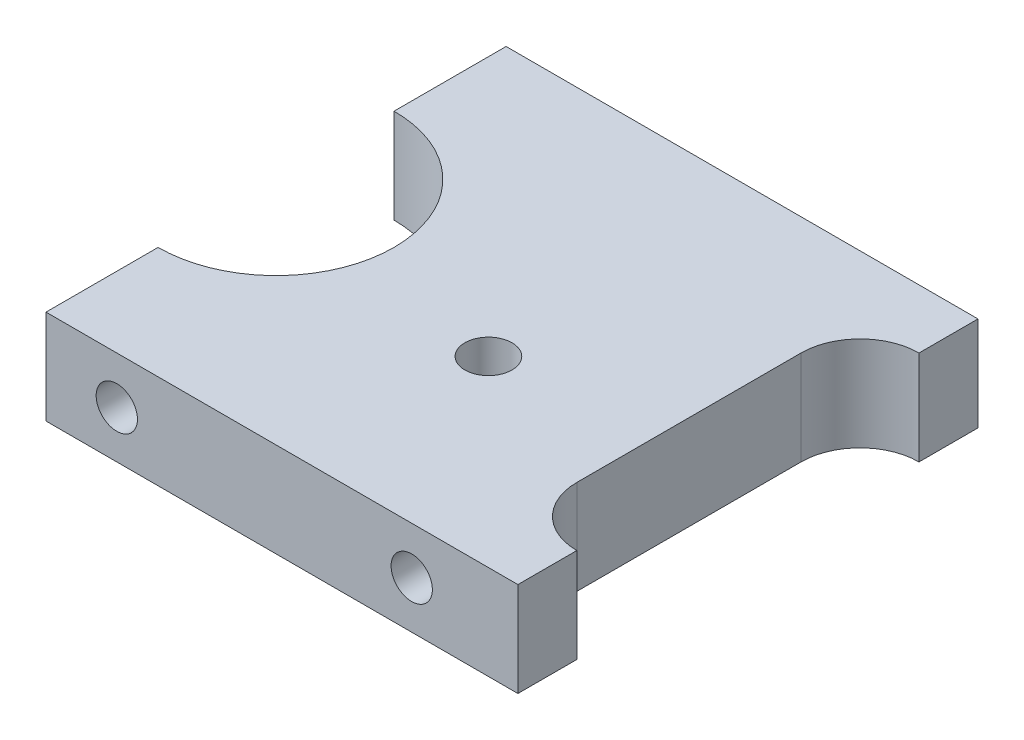
ISO-10303-21;
HEADER;
FILE_DESCRIPTION(('STEP AP214'),'2;1');
FILE_NAME('part.step','',(''),(''),'','','');
FILE_SCHEMA(('AUTOMOTIVE_DESIGN { 1 0 10303 214 1 1 1 1 }'));
ENDSEC;
DATA;
#1=APPLICATION_CONTEXT('core data for automotive mechanical design processes');
#2=APPLICATION_PROTOCOL_DEFINITION('international standard','automotive_design',2000,#1);
#3=PRODUCT_CONTEXT('',#1,'mechanical');
#4=PRODUCT('Part','Part','',(#3));
#5=PRODUCT_RELATED_PRODUCT_CATEGORY('part','',(#4));
#6=PRODUCT_DEFINITION_FORMATION('','',#4);
#7=PRODUCT_DEFINITION_CONTEXT('part definition',#1,'design');
#8=PRODUCT_DEFINITION('design','',#6,#7);
#9=PRODUCT_DEFINITION_SHAPE('','',#8);
#10=(LENGTH_UNIT() NAMED_UNIT(*) SI_UNIT(.MILLI.,.METRE.));
#11=(NAMED_UNIT(*) PLANE_ANGLE_UNIT() SI_UNIT($,.RADIAN.));
#12=(NAMED_UNIT(*) SI_UNIT($,.STERADIAN.) SOLID_ANGLE_UNIT());
#13=UNCERTAINTY_MEASURE_WITH_UNIT(LENGTH_MEASURE(1.E-05),#10,'distance_accuracy_value','');
#14=(GEOMETRIC_REPRESENTATION_CONTEXT(3) GLOBAL_UNCERTAINTY_ASSIGNED_CONTEXT((#13)) GLOBAL_UNIT_ASSIGNED_CONTEXT((#10,
#11,#12)) REPRESENTATION_CONTEXT('',''));
#15=CARTESIAN_POINT('',(0.,0.,0.));
#16=DIRECTION('',(0.,0.,1.));
#17=DIRECTION('',(1.,0.,0.));
#18=AXIS2_PLACEMENT_3D('',#15,#16,#17);
#19=CARTESIAN_POINT('',(18.,8.,-23.5));
#20=DIRECTION('',(-1.,0.,0.));
#21=DIRECTION('',(0.,0.,1.));
#22=AXIS2_PLACEMENT_3D('',#19,#20,#21);
#23=PLANE('',#22);
#24=DIRECTION('',(0.,0.,-1.));
#25=VECTOR('',#24,1.);
#26=CARTESIAN_POINT('',(18.,0.,-23.5));
#27=LINE('',#26,#25);
#28=CARTESIAN_POINT('',(18.,0.,15.5));
#29=VERTEX_POINT('',#28);
#30=CARTESIAN_POINT('',(18.,0.,10.5));
#31=VERTEX_POINT('',#30);
#32=EDGE_CURVE('E197',#29,#31,#27,.T.);
#33=ORIENTED_EDGE('',*,*,#32,.T.);
#34=DIRECTION('',(0.,1.,0.));
#35=VECTOR('',#34,1.);
#36=CARTESIAN_POINT('',(18.,-2.,10.5));
#37=LINE('',#36,#35);
#38=CARTESIAN_POINT('',(18.,8.,10.5));
#39=VERTEX_POINT('',#38);
#40=EDGE_CURVE('E48',#31,#39,#37,.T.);
#41=ORIENTED_EDGE('',*,*,#40,.T.);
#42=DIRECTION('',(0.,0.,-1.));
#43=VECTOR('',#42,1.);
#44=CARTESIAN_POINT('',(18.,8.,-23.5));
#45=LINE('',#44,#43);
#46=CARTESIAN_POINT('',(18.,8.,15.5));
#47=VERTEX_POINT('',#46);
#48=EDGE_CURVE('E186',#47,#39,#45,.T.);
#49=ORIENTED_EDGE('',*,*,#48,.F.);
#50=DIRECTION('',(0.,-1.,0.));
#51=VECTOR('',#50,1.);
#52=CARTESIAN_POINT('',(18.,8.,15.5));
#53=LINE('',#52,#51);
#54=EDGE_CURVE('E207',#47,#29,#53,.T.);
#55=ORIENTED_EDGE('',*,*,#54,.T.);
#56=EDGE_LOOP('',(#33,#41,#49,#55));
#57=FACE_BOUND('',#56,.T.);
#58=ADVANCED_FACE('F40',(#57),#23,.F.);
#59=CARTESIAN_POINT('',(-22.,8.,-23.5));
#60=DIRECTION('',(1.,0.,0.));
#61=DIRECTION('',(0.,0.,-1.));
#62=AXIS2_PLACEMENT_3D('',#59,#60,#61);
#63=PLANE('',#62);
#64=DIRECTION('',(0.,0.,1.));
#65=VECTOR('',#64,1.);
#66=CARTESIAN_POINT('',(-22.,8.,-23.5));
#67=LINE('',#66,#65);
#68=CARTESIAN_POINT('',(-22.,8.,6.));
#69=VERTEX_POINT('',#68);
#70=CARTESIAN_POINT('',(-22.,8.,15.5));
#71=VERTEX_POINT('',#70);
#72=EDGE_CURVE('E183',#69,#71,#67,.T.);
#73=ORIENTED_EDGE('',*,*,#72,.F.);
#74=DIRECTION('',(0.,-1.,0.));
#75=VECTOR('',#74,1.);
#76=CARTESIAN_POINT('',(-22.,10.,6.));
#77=LINE('',#76,#75);
#78=CARTESIAN_POINT('',(-22.,0.,6.));
#79=VERTEX_POINT('',#78);
#80=EDGE_CURVE('E215',#69,#79,#77,.T.);
#81=ORIENTED_EDGE('',*,*,#80,.T.);
#82=DIRECTION('',(0.,0.,1.));
#83=VECTOR('',#82,1.);
#84=CARTESIAN_POINT('',(-22.,0.,-23.5));
#85=LINE('',#84,#83);
#86=CARTESIAN_POINT('',(-22.,0.,15.5));
#87=VERTEX_POINT('',#86);
#88=EDGE_CURVE('E176',#79,#87,#85,.T.);
#89=ORIENTED_EDGE('',*,*,#88,.T.);
#90=DIRECTION('',(0.,-1.,0.));
#91=VECTOR('',#90,1.);
#92=CARTESIAN_POINT('',(-22.,8.,15.5));
#93=LINE('',#92,#91);
#94=EDGE_CURVE('E210',#71,#87,#93,.T.);
#95=ORIENTED_EDGE('',*,*,#94,.F.);
#96=EDGE_LOOP('',(#73,#81,#89,#95));
#97=FACE_BOUND('',#96,.T.);
#98=ADVANCED_FACE('F246',(#97),#63,.F.);
#99=CARTESIAN_POINT('',(0.,8.,0.));
#100=DIRECTION('',(0.,1.,0.));
#101=DIRECTION('',(0.,0.,1.));
#102=AXIS2_PLACEMENT_3D('',#99,#100,#101);
#103=PLANE('',#102);
#104=CARTESIAN_POINT('',(18.,8.,5.5));
#105=DIRECTION('',(0.,1.,0.));
#106=DIRECTION('',(0.,0.,1.));
#107=AXIS2_PLACEMENT_3D('',#104,#105,#106);
#108=CIRCLE('',#107,5.);
#109=CARTESIAN_POINT('',(13.,8.,5.5));
#110=VERTEX_POINT('',#109);
#111=EDGE_CURVE('E132',#110,#39,#108,.T.);
#112=ORIENTED_EDGE('',*,*,#111,.F.);
#113=DIRECTION('',(0.,0.,1.));
#114=VECTOR('',#113,1.);
#115=CARTESIAN_POINT('',(13.,8.,5.5));
#116=LINE('',#115,#114);
#117=CARTESIAN_POINT('',(13.,8.,-13.5));
#118=VERTEX_POINT('',#117);
#119=EDGE_CURVE('E122',#118,#110,#116,.T.);
#120=ORIENTED_EDGE('',*,*,#119,.F.);
#121=CARTESIAN_POINT('',(18.,8.,-13.5));
#122=DIRECTION('',(0.,1.,0.));
#123=DIRECTION('',(0.,0.,1.));
#124=AXIS2_PLACEMENT_3D('',#121,#122,#123);
#125=CIRCLE('',#124,5.);
#126=CARTESIAN_POINT('',(18.,8.,-18.5));
#127=VERTEX_POINT('',#126);
#128=EDGE_CURVE('E127',#127,#118,#125,.T.);
#129=ORIENTED_EDGE('',*,*,#128,.F.);
#130=CARTESIAN_POINT('',(18.,8.,-23.5));
#131=VERTEX_POINT('',#130);
#132=EDGE_CURVE('E185',#127,#131,#45,.T.);
#133=ORIENTED_EDGE('',*,*,#132,.T.);
#134=DIRECTION('',(-1.,0.,0.));
#135=VECTOR('',#134,1.);
#136=CARTESIAN_POINT('',(-22.,8.,-23.5));
#137=LINE('',#136,#135);
#138=CARTESIAN_POINT('',(-22.,8.,-23.5));
#139=VERTEX_POINT('',#138);
#140=EDGE_CURVE('E188',#131,#139,#137,.T.);
#141=ORIENTED_EDGE('',*,*,#140,.T.);
#142=CARTESIAN_POINT('',(-22.,8.,-14.));
#143=VERTEX_POINT('',#142);
#144=EDGE_CURVE('E179',#139,#143,#67,.T.);
#145=ORIENTED_EDGE('',*,*,#144,.T.);
#146=CARTESIAN_POINT('',(-22.,8.,-4.));
#147=DIRECTION('',(0.,1.,0.));
#148=DIRECTION('',(0.,0.,1.));
#149=AXIS2_PLACEMENT_3D('',#146,#147,#148);
#150=CIRCLE('',#149,10.);
#151=EDGE_CURVE('E63',#69,#143,#150,.T.);
#152=ORIENTED_EDGE('',*,*,#151,.F.);
#153=ORIENTED_EDGE('',*,*,#72,.T.);
#154=DIRECTION('',(1.,0.,0.));
#155=VECTOR('',#154,1.);
#156=CARTESIAN_POINT('',(-22.,8.,15.5));
#157=LINE('',#156,#155);
#158=EDGE_CURVE('E182',#71,#47,#157,.T.);
#159=ORIENTED_EDGE('',*,*,#158,.T.);
#160=ORIENTED_EDGE('',*,*,#48,.T.);
#161=EDGE_LOOP('',(#112,#120,#129,#133,#141,#145,#152,#153,#159,#160));
#162=FACE_BOUND('',#161,.T.);
#163=CARTESIAN_POINT('',(0.,8.,0.));
#164=DIRECTION('',(0.,1.,0.));
#165=DIRECTION('',(0.,0.,1.));
#166=AXIS2_PLACEMENT_3D('',#163,#164,#165);
#167=CIRCLE('',#166,2.);
#168=CARTESIAN_POINT('',(0.,8.,2.));
#169=VERTEX_POINT('',#168);
#170=EDGE_CURVE('E173',#169,#169,#167,.T.);
#171=ORIENTED_EDGE('',*,*,#170,.F.);
#172=EDGE_LOOP('',(#171));
#173=FACE_BOUND('',#172,.T.);
#174=ADVANCED_FACE('F134',(#162,#173),#103,.T.);
#175=CARTESIAN_POINT('',(0.,0.,0.));
#176=DIRECTION('',(0.,1.,0.));
#177=DIRECTION('',(0.,0.,1.));
#178=AXIS2_PLACEMENT_3D('',#175,#176,#177);
#179=PLANE('',#178);
#180=DIRECTION('',(0.,0.,1.));
#181=VECTOR('',#180,1.);
#182=CARTESIAN_POINT('',(13.,0.,0.));
#183=LINE('',#182,#181);
#184=CARTESIAN_POINT('',(13.,0.,-13.5));
#185=VERTEX_POINT('',#184);
#186=CARTESIAN_POINT('',(13.,0.,5.5));
#187=VERTEX_POINT('',#186);
#188=EDGE_CURVE('E11',#185,#187,#183,.T.);
#189=ORIENTED_EDGE('',*,*,#188,.T.);
#190=CARTESIAN_POINT('',(18.,0.,5.5));
#191=DIRECTION('',(0.,1.,0.));
#192=DIRECTION('',(0.,0.,1.));
#193=AXIS2_PLACEMENT_3D('',#190,#191,#192);
#194=CIRCLE('',#193,5.);
#195=EDGE_CURVE('E142',#187,#31,#194,.T.);
#196=ORIENTED_EDGE('',*,*,#195,.T.);
#197=ORIENTED_EDGE('',*,*,#32,.F.);
#198=DIRECTION('',(1.,0.,0.));
#199=VECTOR('',#198,1.);
#200=CARTESIAN_POINT('',(-22.,0.,15.5));
#201=LINE('',#200,#199);
#202=EDGE_CURVE('E194',#87,#29,#201,.T.);
#203=ORIENTED_EDGE('',*,*,#202,.F.);
#204=ORIENTED_EDGE('',*,*,#88,.F.);
#205=CARTESIAN_POINT('',(-22.,0.,-4.));
#206=DIRECTION('',(0.,-1.,0.));
#207=DIRECTION('',(0.,0.,-1.));
#208=AXIS2_PLACEMENT_3D('',#205,#206,#207);
#209=CIRCLE('',#208,10.);
#210=CARTESIAN_POINT('',(-22.,0.,-14.));
#211=VERTEX_POINT('',#210);
#212=EDGE_CURVE('E145',#211,#79,#209,.T.);
#213=ORIENTED_EDGE('',*,*,#212,.F.);
#214=CARTESIAN_POINT('',(-22.,0.,-23.5));
#215=VERTEX_POINT('',#214);
#216=EDGE_CURVE('E191',#215,#211,#85,.T.);
#217=ORIENTED_EDGE('',*,*,#216,.F.);
#218=DIRECTION('',(-1.,0.,0.));
#219=VECTOR('',#218,1.);
#220=CARTESIAN_POINT('',(-22.,0.,-23.5));
#221=LINE('',#220,#219);
#222=CARTESIAN_POINT('',(18.,0.,-23.5));
#223=VERTEX_POINT('',#222);
#224=EDGE_CURVE('E200',#223,#215,#221,.T.);
#225=ORIENTED_EDGE('',*,*,#224,.F.);
#226=CARTESIAN_POINT('',(18.,0.,-18.5));
#227=VERTEX_POINT('',#226);
#228=EDGE_CURVE('E196',#227,#223,#27,.T.);
#229=ORIENTED_EDGE('',*,*,#228,.F.);
#230=CARTESIAN_POINT('',(18.,0.,-13.5));
#231=DIRECTION('',(0.,1.,0.));
#232=DIRECTION('',(0.,0.,1.));
#233=AXIS2_PLACEMENT_3D('',#230,#231,#232);
#234=CIRCLE('',#233,5.);
#235=EDGE_CURVE('E55',#227,#185,#234,.T.);
#236=ORIENTED_EDGE('',*,*,#235,.T.);
#237=EDGE_LOOP('',(#189,#196,#197,#203,#204,#213,#217,#225,#229,#236));
#238=FACE_BOUND('',#237,.T.);
#239=CARTESIAN_POINT('',(0.,0.,0.));
#240=DIRECTION('',(0.,1.,0.));
#241=DIRECTION('',(0.,0.,1.));
#242=AXIS2_PLACEMENT_3D('',#239,#240,#241);
#243=CIRCLE('',#242,2.);
#244=CARTESIAN_POINT('',(0.,0.,2.));
#245=VERTEX_POINT('',#244);
#246=EDGE_CURVE('E164',#245,#245,#243,.T.);
#247=ORIENTED_EDGE('',*,*,#246,.T.);
#248=EDGE_LOOP('',(#247));
#249=FACE_BOUND('',#248,.T.);
#250=ADVANCED_FACE('F231',(#238,#249),#179,.F.);
#251=ORIENTED_EDGE('',*,*,#216,.T.);
#252=DIRECTION('',(0.,-1.,0.));
#253=VECTOR('',#252,1.);
#254=CARTESIAN_POINT('',(-22.,10.,-14.));
#255=LINE('',#254,#253);
#256=EDGE_CURVE('E213',#211,#143,#255,.F.);
#257=ORIENTED_EDGE('',*,*,#256,.T.);
#258=ORIENTED_EDGE('',*,*,#144,.F.);
#259=DIRECTION('',(0.,-1.,0.));
#260=VECTOR('',#259,1.);
#261=CARTESIAN_POINT('',(-22.,8.,-23.5));
#262=LINE('',#261,#260);
#263=EDGE_CURVE('E190',#139,#215,#262,.T.);
#264=ORIENTED_EDGE('',*,*,#263,.T.);
#265=EDGE_LOOP('',(#251,#257,#258,#264));
#266=FACE_BOUND('',#265,.T.);
#267=ADVANCED_FACE('F42',(#266),#63,.F.);
#268=CARTESIAN_POINT('',(-22.,8.,15.5));
#269=DIRECTION('',(0.,0.,-1.));
#270=DIRECTION('',(-1.,0.,0.));
#271=AXIS2_PLACEMENT_3D('',#268,#269,#270);
#272=PLANE('',#271);
#273=CARTESIAN_POINT('',(9.,4.,15.5));
#274=DIRECTION('',(0.,0.,1.));
#275=DIRECTION('',(1.,0.,0.));
#276=AXIS2_PLACEMENT_3D('',#273,#274,#275);
#277=CIRCLE('',#276,1.75);
#278=CARTESIAN_POINT('',(10.75,4.,15.5));
#279=VERTEX_POINT('',#278);
#280=EDGE_CURVE('E165',#279,#279,#277,.T.);
#281=ORIENTED_EDGE('',*,*,#280,.F.);
#282=EDGE_LOOP('',(#281));
#283=FACE_BOUND('',#282,.T.);
#284=CARTESIAN_POINT('',(-16.,4.,15.5));
#285=DIRECTION('',(0.,0.,1.));
#286=DIRECTION('',(1.,0.,0.));
#287=AXIS2_PLACEMENT_3D('',#284,#285,#286);
#288=CIRCLE('',#287,1.75);
#289=CARTESIAN_POINT('',(-14.25,4.,15.5));
#290=VERTEX_POINT('',#289);
#291=EDGE_CURVE('E152',#290,#290,#288,.T.);
#292=ORIENTED_EDGE('',*,*,#291,.F.);
#293=EDGE_LOOP('',(#292));
#294=FACE_BOUND('',#293,.T.);
#295=ORIENTED_EDGE('',*,*,#202,.T.);
#296=ORIENTED_EDGE('',*,*,#54,.F.);
#297=ORIENTED_EDGE('',*,*,#158,.F.);
#298=ORIENTED_EDGE('',*,*,#94,.T.);
#299=EDGE_LOOP('',(#295,#296,#297,#298));
#300=FACE_BOUND('',#299,.T.);
#301=ADVANCED_FACE('F228',(#283,#294,#300),#272,.F.);
#302=ORIENTED_EDGE('',*,*,#132,.F.);
#303=DIRECTION('',(0.,1.,0.));
#304=VECTOR('',#303,1.);
#305=CARTESIAN_POINT('',(18.,-2.,-18.5));
#306=LINE('',#305,#304);
#307=EDGE_CURVE('E129',#127,#227,#306,.F.);
#308=ORIENTED_EDGE('',*,*,#307,.T.);
#309=ORIENTED_EDGE('',*,*,#228,.T.);
#310=DIRECTION('',(0.,-1.,0.));
#311=VECTOR('',#310,1.);
#312=CARTESIAN_POINT('',(18.,8.,-23.5));
#313=LINE('',#312,#311);
#314=EDGE_CURVE('E204',#131,#223,#313,.T.);
#315=ORIENTED_EDGE('',*,*,#314,.F.);
#316=EDGE_LOOP('',(#302,#308,#309,#315));
#317=FACE_BOUND('',#316,.T.);
#318=ADVANCED_FACE('F248',(#317),#23,.F.);
#319=CARTESIAN_POINT('',(-22.,8.,-23.5));
#320=DIRECTION('',(0.,0.,1.));
#321=DIRECTION('',(1.,0.,0.));
#322=AXIS2_PLACEMENT_3D('',#319,#320,#321);
#323=PLANE('',#322);
#324=CARTESIAN_POINT('',(9.,4.,-23.5));
#325=DIRECTION('',(0.,0.,1.));
#326=DIRECTION('',(1.,0.,0.));
#327=AXIS2_PLACEMENT_3D('',#324,#325,#326);
#328=CIRCLE('',#327,1.75);
#329=CARTESIAN_POINT('',(10.75,4.,-23.5));
#330=VERTEX_POINT('',#329);
#331=EDGE_CURVE('E153',#330,#330,#328,.T.);
#332=ORIENTED_EDGE('',*,*,#331,.T.);
#333=EDGE_LOOP('',(#332));
#334=FACE_BOUND('',#333,.T.);
#335=CARTESIAN_POINT('',(-16.,4.,-23.5));
#336=DIRECTION('',(0.,0.,1.));
#337=DIRECTION('',(1.,0.,0.));
#338=AXIS2_PLACEMENT_3D('',#335,#336,#337);
#339=CIRCLE('',#338,1.75);
#340=CARTESIAN_POINT('',(-14.25,4.,-23.5));
#341=VERTEX_POINT('',#340);
#342=EDGE_CURVE('E148',#341,#341,#339,.T.);
#343=ORIENTED_EDGE('',*,*,#342,.T.);
#344=EDGE_LOOP('',(#343));
#345=FACE_BOUND('',#344,.T.);
#346=ORIENTED_EDGE('',*,*,#224,.T.);
#347=ORIENTED_EDGE('',*,*,#263,.F.);
#348=ORIENTED_EDGE('',*,*,#140,.F.);
#349=ORIENTED_EDGE('',*,*,#314,.T.);
#350=EDGE_LOOP('',(#346,#347,#348,#349));
#351=FACE_BOUND('',#350,.T.);
#352=ADVANCED_FACE('F255',(#334,#345,#351),#323,.F.);
#353=CARTESIAN_POINT('',(0.,8.,0.));
#354=DIRECTION('',(0.,-1.,0.));
#355=DIRECTION('',(0.,0.,-1.));
#356=AXIS2_PLACEMENT_3D('',#353,#354,#355);
#357=CYLINDRICAL_SURFACE('',#356,2.);
#358=ORIENTED_EDGE('',*,*,#170,.T.);
#359=EDGE_LOOP('',(#358));
#360=FACE_BOUND('',#359,.T.);
#361=ORIENTED_EDGE('',*,*,#246,.F.);
#362=EDGE_LOOP('',(#361));
#363=FACE_BOUND('',#362,.T.);
#364=ADVANCED_FACE('F261',(#360,#363),#357,.F.);
#365=CARTESIAN_POINT('',(-16.,4.,7.5));
#366=DIRECTION('',(0.,0.,1.));
#367=DIRECTION('',(1.,0.,0.));
#368=AXIS2_PLACEMENT_3D('',#365,#366,#367);
#369=CYLINDRICAL_SURFACE('',#368,1.75);
#370=CARTESIAN_POINT('',(-16.,4.,7.5));
#371=DIRECTION('',(0.,0.,1.));
#372=DIRECTION('',(1.,0.,0.));
#373=AXIS2_PLACEMENT_3D('',#370,#371,#372);
#374=CIRCLE('',#373,1.75);
#375=CARTESIAN_POINT('',(-14.25,4.,7.5));
#376=VERTEX_POINT('',#375);
#377=EDGE_CURVE('E168',#376,#376,#374,.T.);
#378=ORIENTED_EDGE('',*,*,#377,.F.);
#379=EDGE_LOOP('',(#378));
#380=FACE_BOUND('',#379,.T.);
#381=ORIENTED_EDGE('',*,*,#291,.T.);
#382=EDGE_LOOP('',(#381));
#383=FACE_BOUND('',#382,.T.);
#384=ADVANCED_FACE('F305',(#380,#383),#369,.F.);
#385=CARTESIAN_POINT('',(-16.,4.,7.5));
#386=DIRECTION('',(0.,0.,1.));
#387=DIRECTION('',(1.,0.,0.));
#388=AXIS2_PLACEMENT_3D('',#385,#386,#387);
#389=PLANE('',#388);
#390=ORIENTED_EDGE('',*,*,#377,.T.);
#391=EDGE_LOOP('',(#390));
#392=FACE_BOUND('',#391,.T.);
#393=ADVANCED_FACE('F301',(#392),#389,.T.);
#394=CARTESIAN_POINT('',(9.,4.,7.5));
#395=DIRECTION('',(0.,0.,1.));
#396=DIRECTION('',(1.,0.,0.));
#397=AXIS2_PLACEMENT_3D('',#394,#395,#396);
#398=CYLINDRICAL_SURFACE('',#397,1.75);
#399=CARTESIAN_POINT('',(9.,4.,7.5));
#400=DIRECTION('',(0.,0.,1.));
#401=DIRECTION('',(1.,0.,0.));
#402=AXIS2_PLACEMENT_3D('',#399,#400,#401);
#403=CIRCLE('',#402,1.75);
#404=CARTESIAN_POINT('',(10.75,4.,7.5));
#405=VERTEX_POINT('',#404);
#406=EDGE_CURVE('E161',#405,#405,#403,.T.);
#407=ORIENTED_EDGE('',*,*,#406,.F.);
#408=EDGE_LOOP('',(#407));
#409=FACE_BOUND('',#408,.T.);
#410=ORIENTED_EDGE('',*,*,#280,.T.);
#411=EDGE_LOOP('',(#410));
#412=FACE_BOUND('',#411,.T.);
#413=ADVANCED_FACE('F297',(#409,#412),#398,.F.);
#414=CARTESIAN_POINT('',(9.,4.,7.5));
#415=DIRECTION('',(0.,0.,1.));
#416=DIRECTION('',(1.,0.,0.));
#417=AXIS2_PLACEMENT_3D('',#414,#415,#416);
#418=PLANE('',#417);
#419=ORIENTED_EDGE('',*,*,#406,.T.);
#420=EDGE_LOOP('',(#419));
#421=FACE_BOUND('',#420,.T.);
#422=ADVANCED_FACE('F293',(#421),#418,.T.);
#423=CARTESIAN_POINT('',(-16.,4.,-15.5));
#424=DIRECTION('',(0.,0.,-1.));
#425=DIRECTION('',(-1.,0.,0.));
#426=AXIS2_PLACEMENT_3D('',#423,#424,#425);
#427=CYLINDRICAL_SURFACE('',#426,1.75);
#428=CARTESIAN_POINT('',(-16.,4.,-15.5));
#429=DIRECTION('',(0.,0.,1.));
#430=DIRECTION('',(1.,0.,0.));
#431=AXIS2_PLACEMENT_3D('',#428,#429,#430);
#432=CIRCLE('',#431,1.75);
#433=CARTESIAN_POINT('',(-14.25,4.,-15.5));
#434=VERTEX_POINT('',#433);
#435=EDGE_CURVE('E156',#434,#434,#432,.T.);
#436=ORIENTED_EDGE('',*,*,#435,.T.);
#437=EDGE_LOOP('',(#436));
#438=FACE_BOUND('',#437,.T.);
#439=ORIENTED_EDGE('',*,*,#342,.F.);
#440=EDGE_LOOP('',(#439));
#441=FACE_BOUND('',#440,.T.);
#442=ADVANCED_FACE('F289',(#438,#441),#427,.F.);
#443=CARTESIAN_POINT('',(-16.,4.,-15.5));
#444=DIRECTION('',(0.,0.,1.));
#445=DIRECTION('',(1.,0.,0.));
#446=AXIS2_PLACEMENT_3D('',#443,#444,#445);
#447=PLANE('',#446);
#448=ORIENTED_EDGE('',*,*,#435,.F.);
#449=EDGE_LOOP('',(#448));
#450=FACE_BOUND('',#449,.T.);
#451=ADVANCED_FACE('F285',(#450),#447,.F.);
#452=CARTESIAN_POINT('',(9.,4.,-15.5));
#453=DIRECTION('',(0.,0.,-1.));
#454=DIRECTION('',(-1.,0.,0.));
#455=AXIS2_PLACEMENT_3D('',#452,#453,#454);
#456=CYLINDRICAL_SURFACE('',#455,1.75);
#457=CARTESIAN_POINT('',(9.,4.,-15.5));
#458=DIRECTION('',(0.,0.,1.));
#459=DIRECTION('',(1.,0.,0.));
#460=AXIS2_PLACEMENT_3D('',#457,#458,#459);
#461=CIRCLE('',#460,1.75);
#462=CARTESIAN_POINT('',(10.75,4.,-15.5));
#463=VERTEX_POINT('',#462);
#464=EDGE_CURVE('E149',#463,#463,#461,.T.);
#465=ORIENTED_EDGE('',*,*,#464,.T.);
#466=EDGE_LOOP('',(#465));
#467=FACE_BOUND('',#466,.T.);
#468=ORIENTED_EDGE('',*,*,#331,.F.);
#469=EDGE_LOOP('',(#468));
#470=FACE_BOUND('',#469,.T.);
#471=ADVANCED_FACE('F279',(#467,#470),#456,.F.);
#472=CARTESIAN_POINT('',(9.,4.,-15.5));
#473=DIRECTION('',(0.,0.,1.));
#474=DIRECTION('',(1.,0.,0.));
#475=AXIS2_PLACEMENT_3D('',#472,#473,#474);
#476=PLANE('',#475);
#477=ORIENTED_EDGE('',*,*,#464,.F.);
#478=EDGE_LOOP('',(#477));
#479=FACE_BOUND('',#478,.T.);
#480=ADVANCED_FACE('F275',(#479),#476,.F.);
#481=CARTESIAN_POINT('',(-22.,10.,-4.));
#482=DIRECTION('',(0.,-1.,0.));
#483=DIRECTION('',(0.,0.,-1.));
#484=AXIS2_PLACEMENT_3D('',#481,#482,#483);
#485=CYLINDRICAL_SURFACE('',#484,10.);
#486=ORIENTED_EDGE('',*,*,#151,.T.);
#487=ORIENTED_EDGE('',*,*,#256,.F.);
#488=ORIENTED_EDGE('',*,*,#212,.T.);
#489=ORIENTED_EDGE('',*,*,#80,.F.);
#490=EDGE_LOOP('',(#486,#487,#488,#489));
#491=FACE_BOUND('',#490,.T.);
#492=ADVANCED_FACE('F242',(#491),#485,.F.);
#493=CARTESIAN_POINT('',(13.,-2.,5.5));
#494=DIRECTION('',(-1.,0.,0.));
#495=DIRECTION('',(0.,0.,1.));
#496=AXIS2_PLACEMENT_3D('',#493,#494,#495);
#497=PLANE('',#496);
#498=DIRECTION('',(0.,1.,0.));
#499=VECTOR('',#498,1.);
#500=CARTESIAN_POINT('',(13.,-2.,-13.5));
#501=LINE('',#500,#499);
#502=EDGE_CURVE('E117',#185,#118,#501,.T.);
#503=ORIENTED_EDGE('',*,*,#502,.T.);
#504=ORIENTED_EDGE('',*,*,#119,.T.);
#505=DIRECTION('',(0.,1.,0.));
#506=VECTOR('',#505,1.);
#507=CARTESIAN_POINT('',(13.,-2.,5.5));
#508=LINE('',#507,#506);
#509=EDGE_CURVE('E124',#187,#110,#508,.T.);
#510=ORIENTED_EDGE('',*,*,#509,.F.);
#511=ORIENTED_EDGE('',*,*,#188,.F.);
#512=EDGE_LOOP('',(#503,#504,#510,#511));
#513=FACE_BOUND('',#512,.T.);
#514=ADVANCED_FACE('F119',(#513),#497,.F.);
#515=CARTESIAN_POINT('',(18.,-2.,5.5));
#516=DIRECTION('',(0.,1.,0.));
#517=DIRECTION('',(0.,0.,1.));
#518=AXIS2_PLACEMENT_3D('',#515,#516,#517);
#519=CYLINDRICAL_SURFACE('',#518,5.);
#520=ORIENTED_EDGE('',*,*,#509,.T.);
#521=ORIENTED_EDGE('',*,*,#111,.T.);
#522=ORIENTED_EDGE('',*,*,#40,.F.);
#523=ORIENTED_EDGE('',*,*,#195,.F.);
#524=EDGE_LOOP('',(#520,#521,#522,#523));
#525=FACE_BOUND('',#524,.T.);
#526=ADVANCED_FACE('F234',(#525),#519,.F.);
#527=CARTESIAN_POINT('',(18.,-2.,-13.5));
#528=DIRECTION('',(0.,1.,0.));
#529=DIRECTION('',(0.,0.,1.));
#530=AXIS2_PLACEMENT_3D('',#527,#528,#529);
#531=CYLINDRICAL_SURFACE('',#530,5.);
#532=ORIENTED_EDGE('',*,*,#307,.F.);
#533=ORIENTED_EDGE('',*,*,#128,.T.);
#534=ORIENTED_EDGE('',*,*,#502,.F.);
#535=ORIENTED_EDGE('',*,*,#235,.F.);
#536=EDGE_LOOP('',(#532,#533,#534,#535));
#537=FACE_BOUND('',#536,.T.);
#538=ADVANCED_FACE('F128',(#537),#531,.F.);
#539=CLOSED_SHELL('',(#58,#98,#174,#250,#267,#301,#318,#352,#364,#384,#393,#413,#422,#442,#451,
#471,#480,#492,#514,#526,#538));
#540=MANIFOLD_SOLID_BREP('B2',#539);
#541=ADVANCED_BREP_SHAPE_REPRESENTATION('',(#18,#540),#14);
#542=SHAPE_DEFINITION_REPRESENTATION(#9,#541);
ENDSEC;
END-ISO-10303-21;
